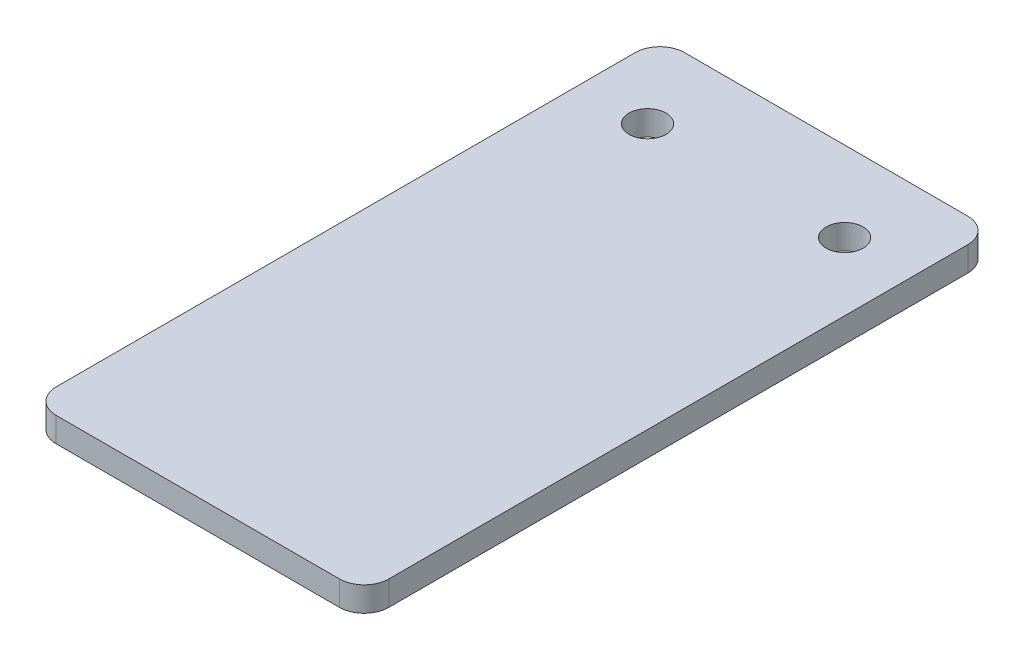
ISO-10303-21;
HEADER;
FILE_DESCRIPTION(('STEP AP214'),'2;1');
FILE_NAME('part.step','',(''),(''),'','','');
FILE_SCHEMA(('AUTOMOTIVE_DESIGN { 1 0 10303 214 1 1 1 1 }'));
ENDSEC;
DATA;
#1=APPLICATION_CONTEXT('core data for automotive mechanical design processes');
#2=APPLICATION_PROTOCOL_DEFINITION('international standard','automotive_design',2000,#1);
#3=PRODUCT_CONTEXT('',#1,'mechanical');
#4=PRODUCT('Part','Part','',(#3));
#5=PRODUCT_RELATED_PRODUCT_CATEGORY('part','',(#4));
#6=PRODUCT_DEFINITION_FORMATION('','',#4);
#7=PRODUCT_DEFINITION_CONTEXT('part definition',#1,'design');
#8=PRODUCT_DEFINITION('design','',#6,#7);
#9=PRODUCT_DEFINITION_SHAPE('','',#8);
#10=(LENGTH_UNIT() NAMED_UNIT(*) SI_UNIT(.MILLI.,.METRE.));
#11=(NAMED_UNIT(*) PLANE_ANGLE_UNIT() SI_UNIT($,.RADIAN.));
#12=(NAMED_UNIT(*) SI_UNIT($,.STERADIAN.) SOLID_ANGLE_UNIT());
#13=UNCERTAINTY_MEASURE_WITH_UNIT(LENGTH_MEASURE(1.E-05),#10,'distance_accuracy_value','');
#14=(GEOMETRIC_REPRESENTATION_CONTEXT(3) GLOBAL_UNCERTAINTY_ASSIGNED_CONTEXT((#13)) GLOBAL_UNIT_ASSIGNED_CONTEXT((#10,
#11,#12)) REPRESENTATION_CONTEXT('',''));
#15=CARTESIAN_POINT('',(0.,0.,0.));
#16=DIRECTION('',(0.,0.,1.));
#17=DIRECTION('',(1.,0.,0.));
#18=AXIS2_PLACEMENT_3D('',#15,#16,#17);
#19=CARTESIAN_POINT('',(2.,2.,-2.));
#20=DIRECTION('',(0.,-1.,0.));
#21=DIRECTION('',(0.,0.,-1.));
#22=AXIS2_PLACEMENT_3D('',#19,#20,#21);
#23=PLANE('',#22);
#24=CARTESIAN_POINT('',(2.,2.,-2.));
#25=DIRECTION('',(0.,1.,0.));
#26=DIRECTION('',(0.,0.,-1.));
#27=AXIS2_PLACEMENT_3D('',#24,#25,#26);
#28=CIRCLE('',#27,2.);
#29=CARTESIAN_POINT('',(0.,2.,-2.00000000000001));
#30=VERTEX_POINT('',#29);
#31=CARTESIAN_POINT('',(2.00000000000001,2.,0.));
#32=VERTEX_POINT('',#31);
#33=EDGE_CURVE('E170',#30,#32,#28,.T.);
#34=ORIENTED_EDGE('',*,*,#33,.T.);
#35=DIRECTION('',(1.,0.,0.));
#36=VECTOR('',#35,1.);
#37=CARTESIAN_POINT('',(2.00000000000001,2.,0.));
#38=LINE('',#37,#36);
#39=CARTESIAN_POINT('',(25.,2.,0.));
#40=VERTEX_POINT('',#39);
#41=EDGE_CURVE('E106',#32,#40,#38,.T.);
#42=ORIENTED_EDGE('',*,*,#41,.T.);
#43=CARTESIAN_POINT('',(25.,2.,-2.));
#44=DIRECTION('',(0.,1.,0.));
#45=DIRECTION('',(0.,0.,1.));
#46=AXIS2_PLACEMENT_3D('',#43,#44,#45);
#47=CIRCLE('',#46,2.);
#48=CARTESIAN_POINT('',(27.,2.,-2.00000000000001));
#49=VERTEX_POINT('',#48);
#50=EDGE_CURVE('E191',#40,#49,#47,.T.);
#51=ORIENTED_EDGE('',*,*,#50,.T.);
#52=DIRECTION('',(0.,0.,-1.));
#53=VECTOR('',#52,1.);
#54=CARTESIAN_POINT('',(27.,2.,-2.00000000000001));
#55=LINE('',#54,#53);
#56=CARTESIAN_POINT('',(27.,2.,-49.));
#57=VERTEX_POINT('',#56);
#58=EDGE_CURVE('E205',#49,#57,#55,.T.);
#59=ORIENTED_EDGE('',*,*,#58,.T.);
#60=CARTESIAN_POINT('',(25.,2.,-49.));
#61=DIRECTION('',(0.,1.,0.));
#62=DIRECTION('',(0.,0.,-1.));
#63=AXIS2_PLACEMENT_3D('',#60,#61,#62);
#64=CIRCLE('',#63,2.);
#65=CARTESIAN_POINT('',(25.,2.,-51.));
#66=VERTEX_POINT('',#65);
#67=EDGE_CURVE('E125',#57,#66,#64,.T.);
#68=ORIENTED_EDGE('',*,*,#67,.T.);
#69=DIRECTION('',(-1.,0.,0.));
#70=VECTOR('',#69,1.);
#71=CARTESIAN_POINT('',(2.00000000000001,2.,-51.));
#72=LINE('',#71,#70);
#73=CARTESIAN_POINT('',(2.00000000000001,2.,-51.));
#74=VERTEX_POINT('',#73);
#75=EDGE_CURVE('E119',#66,#74,#72,.T.);
#76=ORIENTED_EDGE('',*,*,#75,.T.);
#77=CARTESIAN_POINT('',(2.,2.,-49.));
#78=DIRECTION('',(0.,1.,0.));
#79=DIRECTION('',(0.,0.,-1.));
#80=AXIS2_PLACEMENT_3D('',#77,#78,#79);
#81=CIRCLE('',#80,2.);
#82=CARTESIAN_POINT('',(0.,2.,-49.));
#83=VERTEX_POINT('',#82);
#84=EDGE_CURVE('E123',#74,#83,#81,.T.);
#85=ORIENTED_EDGE('',*,*,#84,.T.);
#86=DIRECTION('',(0.,0.,1.));
#87=VECTOR('',#86,1.);
#88=CARTESIAN_POINT('',(0.,2.,-2.00000000000001));
#89=LINE('',#88,#87);
#90=EDGE_CURVE('E63',#83,#30,#89,.T.);
#91=ORIENTED_EDGE('',*,*,#90,.T.);
#92=EDGE_LOOP('',(#34,#42,#51,#59,#68,#76,#85,#91));
#93=FACE_BOUND('',#92,.T.);
#94=CARTESIAN_POINT('',(21.5,2.,-44.5));
#95=DIRECTION('',(0.,1.,0.));
#96=DIRECTION('',(0.,0.,1.));
#97=AXIS2_PLACEMENT_3D('',#94,#95,#96);
#98=CIRCLE('',#97,1.5);
#99=CARTESIAN_POINT('',(21.5,2.,-43.));
#100=VERTEX_POINT('',#99);
#101=EDGE_CURVE('E152',#100,#100,#98,.T.);
#102=ORIENTED_EDGE('',*,*,#101,.F.);
#103=EDGE_LOOP('',(#102));
#104=FACE_BOUND('',#103,.T.);
#105=CARTESIAN_POINT('',(5.50000000000001,2.,-44.5));
#106=DIRECTION('',(0.,1.,0.));
#107=DIRECTION('',(0.,0.,-1.));
#108=AXIS2_PLACEMENT_3D('',#105,#106,#107);
#109=CIRCLE('',#108,1.5);
#110=CARTESIAN_POINT('',(5.50000000000001,2.,-46.));
#111=VERTEX_POINT('',#110);
#112=EDGE_CURVE('E219',#111,#111,#109,.T.);
#113=ORIENTED_EDGE('',*,*,#112,.F.);
#114=EDGE_LOOP('',(#113));
#115=FACE_BOUND('',#114,.T.);
#116=ADVANCED_FACE('F45',(#93,#104,#115),#23,.F.);
#117=CARTESIAN_POINT('',(2.,0.,-2.));
#118=DIRECTION('',(0.,-1.,0.));
#119=DIRECTION('',(0.,0.,-1.));
#120=AXIS2_PLACEMENT_3D('',#117,#118,#119);
#121=PLANE('',#120);
#122=CARTESIAN_POINT('',(21.5,0.,-44.5));
#123=DIRECTION('',(0.,1.,0.));
#124=DIRECTION('',(0.,0.,1.));
#125=AXIS2_PLACEMENT_3D('',#122,#123,#124);
#126=CIRCLE('',#125,1.5);
#127=CARTESIAN_POINT('',(21.5,0.,-43.));
#128=VERTEX_POINT('',#127);
#129=EDGE_CURVE('E215',#128,#128,#126,.T.);
#130=ORIENTED_EDGE('',*,*,#129,.T.);
#131=EDGE_LOOP('',(#130));
#132=FACE_BOUND('',#131,.T.);
#133=CARTESIAN_POINT('',(2.,0.,-2.));
#134=DIRECTION('',(0.,1.,0.));
#135=DIRECTION('',(0.,0.,-1.));
#136=AXIS2_PLACEMENT_3D('',#133,#134,#135);
#137=CIRCLE('',#136,2.);
#138=CARTESIAN_POINT('',(0.,0.,-2.00000000000001));
#139=VERTEX_POINT('',#138);
#140=CARTESIAN_POINT('',(2.00000000000001,0.,0.));
#141=VERTEX_POINT('',#140);
#142=EDGE_CURVE('E147',#139,#141,#137,.T.);
#143=ORIENTED_EDGE('',*,*,#142,.F.);
#144=DIRECTION('',(0.,0.,1.));
#145=VECTOR('',#144,1.);
#146=CARTESIAN_POINT('',(0.,0.,-2.00000000000001));
#147=LINE('',#146,#145);
#148=CARTESIAN_POINT('',(0.,0.,-49.));
#149=VERTEX_POINT('',#148);
#150=EDGE_CURVE('E98',#149,#139,#147,.T.);
#151=ORIENTED_EDGE('',*,*,#150,.F.);
#152=CARTESIAN_POINT('',(2.,0.,-49.));
#153=DIRECTION('',(0.,1.,0.));
#154=DIRECTION('',(0.,0.,-1.));
#155=AXIS2_PLACEMENT_3D('',#152,#153,#154);
#156=CIRCLE('',#155,2.);
#157=CARTESIAN_POINT('',(2.00000000000001,0.,-51.));
#158=VERTEX_POINT('',#157);
#159=EDGE_CURVE('E92',#158,#149,#156,.T.);
#160=ORIENTED_EDGE('',*,*,#159,.F.);
#161=DIRECTION('',(-1.,0.,0.));
#162=VECTOR('',#161,1.);
#163=CARTESIAN_POINT('',(2.00000000000001,0.,-51.));
#164=LINE('',#163,#162);
#165=CARTESIAN_POINT('',(25.,0.,-51.));
#166=VERTEX_POINT('',#165);
#167=EDGE_CURVE('E134',#166,#158,#164,.T.);
#168=ORIENTED_EDGE('',*,*,#167,.F.);
#169=CARTESIAN_POINT('',(25.,0.,-49.));
#170=DIRECTION('',(0.,1.,0.));
#171=DIRECTION('',(0.,0.,-1.));
#172=AXIS2_PLACEMENT_3D('',#169,#170,#171);
#173=CIRCLE('',#172,2.);
#174=CARTESIAN_POINT('',(27.,0.,-49.));
#175=VERTEX_POINT('',#174);
#176=EDGE_CURVE('E161',#175,#166,#173,.T.);
#177=ORIENTED_EDGE('',*,*,#176,.F.);
#178=DIRECTION('',(0.,0.,-1.));
#179=VECTOR('',#178,1.);
#180=CARTESIAN_POINT('',(27.,0.,-2.00000000000001));
#181=LINE('',#180,#179);
#182=CARTESIAN_POINT('',(27.,0.,-2.00000000000001));
#183=VERTEX_POINT('',#182);
#184=EDGE_CURVE('E158',#183,#175,#181,.T.);
#185=ORIENTED_EDGE('',*,*,#184,.F.);
#186=CARTESIAN_POINT('',(25.,0.,-2.));
#187=DIRECTION('',(0.,1.,0.));
#188=DIRECTION('',(0.,0.,1.));
#189=AXIS2_PLACEMENT_3D('',#186,#187,#188);
#190=CIRCLE('',#189,2.);
#191=CARTESIAN_POINT('',(25.,0.,0.));
#192=VERTEX_POINT('',#191);
#193=EDGE_CURVE('E155',#192,#183,#190,.T.);
#194=ORIENTED_EDGE('',*,*,#193,.F.);
#195=DIRECTION('',(1.,0.,0.));
#196=VECTOR('',#195,1.);
#197=CARTESIAN_POINT('',(2.00000000000001,0.,0.));
#198=LINE('',#197,#196);
#199=EDGE_CURVE('E151',#141,#192,#198,.T.);
#200=ORIENTED_EDGE('',*,*,#199,.F.);
#201=EDGE_LOOP('',(#143,#151,#160,#168,#177,#185,#194,#200));
#202=FACE_BOUND('',#201,.T.);
#203=CARTESIAN_POINT('',(5.50000000000001,0.,-44.5));
#204=DIRECTION('',(0.,1.,0.));
#205=DIRECTION('',(0.,0.,-1.));
#206=AXIS2_PLACEMENT_3D('',#203,#204,#205);
#207=CIRCLE('',#206,1.5);
#208=CARTESIAN_POINT('',(5.50000000000001,0.,-46.));
#209=VERTEX_POINT('',#208);
#210=EDGE_CURVE('E223',#209,#209,#207,.T.);
#211=ORIENTED_EDGE('',*,*,#210,.T.);
#212=EDGE_LOOP('',(#211));
#213=FACE_BOUND('',#212,.T.);
#214=ADVANCED_FACE('F195',(#132,#202,#213),#121,.T.);
#215=CARTESIAN_POINT('',(2.,2.,-2.));
#216=DIRECTION('',(0.,-1.,0.));
#217=DIRECTION('',(0.,0.,-1.));
#218=AXIS2_PLACEMENT_3D('',#215,#216,#217);
#219=CYLINDRICAL_SURFACE('',#218,2.);
#220=ORIENTED_EDGE('',*,*,#142,.T.);
#221=DIRECTION('',(0.,-1.,0.));
#222=VECTOR('',#221,1.);
#223=CARTESIAN_POINT('',(2.00000000000001,2.,0.));
#224=LINE('',#223,#222);
#225=EDGE_CURVE('E11',#32,#141,#224,.T.);
#226=ORIENTED_EDGE('',*,*,#225,.F.);
#227=ORIENTED_EDGE('',*,*,#33,.F.);
#228=DIRECTION('',(0.,-1.,0.));
#229=VECTOR('',#228,1.);
#230=CARTESIAN_POINT('',(0.,2.,-2.00000000000001));
#231=LINE('',#230,#229);
#232=EDGE_CURVE('E143',#30,#139,#231,.T.);
#233=ORIENTED_EDGE('',*,*,#232,.T.);
#234=EDGE_LOOP('',(#220,#226,#227,#233));
#235=FACE_BOUND('',#234,.T.);
#236=ADVANCED_FACE('F47',(#235),#219,.T.);
#237=CARTESIAN_POINT('',(2.00000000000001,2.,0.));
#238=DIRECTION('',(0.,0.,-1.));
#239=DIRECTION('',(-1.,0.,0.));
#240=AXIS2_PLACEMENT_3D('',#237,#238,#239);
#241=PLANE('',#240);
#242=ORIENTED_EDGE('',*,*,#199,.T.);
#243=DIRECTION('',(0.,-1.,0.));
#244=VECTOR('',#243,1.);
#245=CARTESIAN_POINT('',(25.,2.,0.));
#246=LINE('',#245,#244);
#247=EDGE_CURVE('E55',#40,#192,#246,.T.);
#248=ORIENTED_EDGE('',*,*,#247,.F.);
#249=ORIENTED_EDGE('',*,*,#41,.F.);
#250=ORIENTED_EDGE('',*,*,#225,.T.);
#251=EDGE_LOOP('',(#242,#248,#249,#250));
#252=FACE_BOUND('',#251,.T.);
#253=ADVANCED_FACE('F257',(#252),#241,.F.);
#254=CARTESIAN_POINT('',(25.,2.,-2.));
#255=DIRECTION('',(0.,-1.,0.));
#256=DIRECTION('',(0.,0.,-1.));
#257=AXIS2_PLACEMENT_3D('',#254,#255,#256);
#258=CYLINDRICAL_SURFACE('',#257,2.);
#259=ORIENTED_EDGE('',*,*,#193,.T.);
#260=DIRECTION('',(0.,-1.,0.));
#261=VECTOR('',#260,1.);
#262=CARTESIAN_POINT('',(27.,2.,-2.00000000000001));
#263=LINE('',#262,#261);
#264=EDGE_CURVE('E181',#49,#183,#263,.T.);
#265=ORIENTED_EDGE('',*,*,#264,.F.);
#266=ORIENTED_EDGE('',*,*,#50,.F.);
#267=ORIENTED_EDGE('',*,*,#247,.T.);
#268=EDGE_LOOP('',(#259,#265,#266,#267));
#269=FACE_BOUND('',#268,.T.);
#270=ADVANCED_FACE('F189',(#269),#258,.T.);
#271=CARTESIAN_POINT('',(27.,2.,-2.00000000000001));
#272=DIRECTION('',(-1.,0.,0.));
#273=DIRECTION('',(0.,0.,1.));
#274=AXIS2_PLACEMENT_3D('',#271,#272,#273);
#275=PLANE('',#274);
#276=ORIENTED_EDGE('',*,*,#184,.T.);
#277=DIRECTION('',(0.,-1.,0.));
#278=VECTOR('',#277,1.);
#279=CARTESIAN_POINT('',(27.,2.,-49.));
#280=LINE('',#279,#278);
#281=EDGE_CURVE('E177',#57,#175,#280,.T.);
#282=ORIENTED_EDGE('',*,*,#281,.F.);
#283=ORIENTED_EDGE('',*,*,#58,.F.);
#284=ORIENTED_EDGE('',*,*,#264,.T.);
#285=EDGE_LOOP('',(#276,#282,#283,#284));
#286=FACE_BOUND('',#285,.T.);
#287=ADVANCED_FACE('F200',(#286),#275,.F.);
#288=CARTESIAN_POINT('',(25.,2.,-49.));
#289=DIRECTION('',(0.,-1.,0.));
#290=DIRECTION('',(0.,0.,-1.));
#291=AXIS2_PLACEMENT_3D('',#288,#289,#290);
#292=CYLINDRICAL_SURFACE('',#291,2.);
#293=ORIENTED_EDGE('',*,*,#176,.T.);
#294=DIRECTION('',(0.,-1.,0.));
#295=VECTOR('',#294,1.);
#296=CARTESIAN_POINT('',(25.,2.,-51.));
#297=LINE('',#296,#295);
#298=EDGE_CURVE('E136',#66,#166,#297,.T.);
#299=ORIENTED_EDGE('',*,*,#298,.F.);
#300=ORIENTED_EDGE('',*,*,#67,.F.);
#301=ORIENTED_EDGE('',*,*,#281,.T.);
#302=EDGE_LOOP('',(#293,#299,#300,#301));
#303=FACE_BOUND('',#302,.T.);
#304=ADVANCED_FACE('F203',(#303),#292,.T.);
#305=CARTESIAN_POINT('',(2.00000000000001,2.,-51.));
#306=DIRECTION('',(0.,0.,1.));
#307=DIRECTION('',(1.,0.,0.));
#308=AXIS2_PLACEMENT_3D('',#305,#306,#307);
#309=PLANE('',#308);
#310=ORIENTED_EDGE('',*,*,#167,.T.);
#311=DIRECTION('',(0.,-1.,0.));
#312=VECTOR('',#311,1.);
#313=CARTESIAN_POINT('',(2.00000000000001,2.,-51.));
#314=LINE('',#313,#312);
#315=EDGE_CURVE('E131',#74,#158,#314,.T.);
#316=ORIENTED_EDGE('',*,*,#315,.F.);
#317=ORIENTED_EDGE('',*,*,#75,.F.);
#318=ORIENTED_EDGE('',*,*,#298,.T.);
#319=EDGE_LOOP('',(#310,#316,#317,#318));
#320=FACE_BOUND('',#319,.T.);
#321=ADVANCED_FACE('F132',(#320),#309,.F.);
#322=CARTESIAN_POINT('',(2.,2.,-49.));
#323=DIRECTION('',(0.,-1.,0.));
#324=DIRECTION('',(0.,0.,-1.));
#325=AXIS2_PLACEMENT_3D('',#322,#323,#324);
#326=CYLINDRICAL_SURFACE('',#325,2.);
#327=ORIENTED_EDGE('',*,*,#159,.T.);
#328=DIRECTION('',(0.,-1.,0.));
#329=VECTOR('',#328,1.);
#330=CARTESIAN_POINT('',(0.,2.,-49.));
#331=LINE('',#330,#329);
#332=EDGE_CURVE('E137',#83,#149,#331,.T.);
#333=ORIENTED_EDGE('',*,*,#332,.F.);
#334=ORIENTED_EDGE('',*,*,#84,.F.);
#335=ORIENTED_EDGE('',*,*,#315,.T.);
#336=EDGE_LOOP('',(#327,#333,#334,#335));
#337=FACE_BOUND('',#336,.T.);
#338=ADVANCED_FACE('F139',(#337),#326,.T.);
#339=CARTESIAN_POINT('',(0.,2.,-2.00000000000001));
#340=DIRECTION('',(1.,0.,0.));
#341=DIRECTION('',(0.,0.,-1.));
#342=AXIS2_PLACEMENT_3D('',#339,#340,#341);
#343=PLANE('',#342);
#344=ORIENTED_EDGE('',*,*,#150,.T.);
#345=ORIENTED_EDGE('',*,*,#232,.F.);
#346=ORIENTED_EDGE('',*,*,#90,.F.);
#347=ORIENTED_EDGE('',*,*,#332,.T.);
#348=EDGE_LOOP('',(#344,#345,#346,#347));
#349=FACE_BOUND('',#348,.T.);
#350=ADVANCED_FACE('F245',(#349),#343,.F.);
#351=CARTESIAN_POINT('',(21.5,2.,-44.5));
#352=DIRECTION('',(0.,-1.,0.));
#353=DIRECTION('',(0.,0.,-1.));
#354=AXIS2_PLACEMENT_3D('',#351,#352,#353);
#355=CYLINDRICAL_SURFACE('',#354,1.5);
#356=ORIENTED_EDGE('',*,*,#101,.T.);
#357=EDGE_LOOP('',(#356));
#358=FACE_BOUND('',#357,.T.);
#359=ORIENTED_EDGE('',*,*,#129,.F.);
#360=EDGE_LOOP('',(#359));
#361=FACE_BOUND('',#360,.T.);
#362=ADVANCED_FACE('F242',(#358,#361),#355,.F.);
#363=CARTESIAN_POINT('',(5.50000000000001,2.,-44.5));
#364=DIRECTION('',(0.,-1.,0.));
#365=DIRECTION('',(0.,0.,-1.));
#366=AXIS2_PLACEMENT_3D('',#363,#364,#365);
#367=CYLINDRICAL_SURFACE('',#366,1.5);
#368=ORIENTED_EDGE('',*,*,#112,.T.);
#369=EDGE_LOOP('',(#368));
#370=FACE_BOUND('',#369,.T.);
#371=ORIENTED_EDGE('',*,*,#210,.F.);
#372=EDGE_LOOP('',(#371));
#373=FACE_BOUND('',#372,.T.);
#374=ADVANCED_FACE('F231',(#370,#373),#367,.F.);
#375=CLOSED_SHELL('',(#116,#214,#236,#253,#270,#287,#304,#321,#338,#350,#362,#374));
#376=MANIFOLD_SOLID_BREP('B2',#375);
#377=ADVANCED_BREP_SHAPE_REPRESENTATION('',(#18,#376),#14);
#378=SHAPE_DEFINITION_REPRESENTATION(#9,#377);
ENDSEC;
END-ISO-10303-21;
